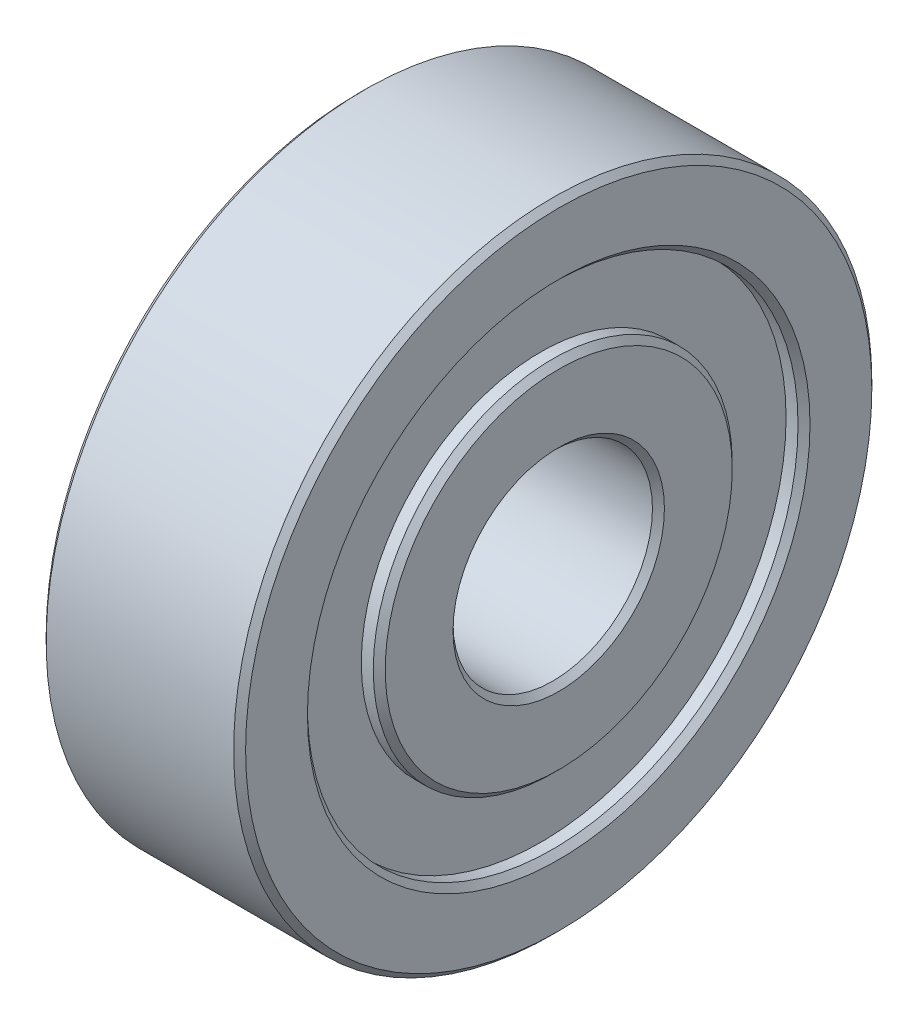
ISO-10303-21;
HEADER;
FILE_DESCRIPTION(('STEP AP214'),'2;1');
FILE_NAME('part.step','',(''),(''),'','','');
FILE_SCHEMA(('AUTOMOTIVE_DESIGN { 1 0 10303 214 1 1 1 1 }'));
ENDSEC;
DATA;
#1=APPLICATION_CONTEXT('core data for automotive mechanical design processes');
#2=APPLICATION_PROTOCOL_DEFINITION('international standard','automotive_design',2000,#1);
#3=PRODUCT_CONTEXT('',#1,'mechanical');
#4=PRODUCT('Part','Part','',(#3));
#5=PRODUCT_RELATED_PRODUCT_CATEGORY('part','',(#4));
#6=PRODUCT_DEFINITION_FORMATION('','',#4);
#7=PRODUCT_DEFINITION_CONTEXT('part definition',#1,'design');
#8=PRODUCT_DEFINITION('design','',#6,#7);
#9=PRODUCT_DEFINITION_SHAPE('','',#8);
#10=(LENGTH_UNIT() NAMED_UNIT(*) SI_UNIT(.MILLI.,.METRE.));
#11=(NAMED_UNIT(*) PLANE_ANGLE_UNIT() SI_UNIT($,.RADIAN.));
#12=(NAMED_UNIT(*) SI_UNIT($,.STERADIAN.) SOLID_ANGLE_UNIT());
#13=UNCERTAINTY_MEASURE_WITH_UNIT(LENGTH_MEASURE(1.E-05),#10,'distance_accuracy_value','');
#14=(GEOMETRIC_REPRESENTATION_CONTEXT(3) GLOBAL_UNCERTAINTY_ASSIGNED_CONTEXT((#13)) GLOBAL_UNIT_ASSIGNED_CONTEXT((#10,
#11,#12)) REPRESENTATION_CONTEXT('',''));
#15=CARTESIAN_POINT('',(0.,0.,0.));
#16=DIRECTION('',(0.,0.,1.));
#17=DIRECTION('',(1.,0.,0.));
#18=AXIS2_PLACEMENT_3D('',#15,#16,#17);
#19=CARTESIAN_POINT('',(2.5,0.,0.));
#20=DIRECTION('',(-1.,0.,0.));
#21=DIRECTION('',(0.,0.,1.));
#22=AXIS2_PLACEMENT_3D('',#19,#20,#21);
#23=CONICAL_SURFACE('',#22,7.85,0.785398163397451);
#24=CARTESIAN_POINT('',(2.5,0.,0.));
#25=DIRECTION('',(1.,0.,0.));
#26=DIRECTION('',(0.,0.,-1.));
#27=AXIS2_PLACEMENT_3D('',#24,#25,#26);
#28=CIRCLE('',#27,7.85);
#29=CARTESIAN_POINT('',(2.5,0.,-7.85));
#30=VERTEX_POINT('',#29);
#31=EDGE_CURVE('E96',#30,#30,#28,.T.);
#32=ORIENTED_EDGE('',*,*,#31,.F.);
#33=EDGE_LOOP('',(#32));
#34=FACE_BOUND('',#33,.T.);
#35=CARTESIAN_POINT('',(2.35,0.,0.));
#36=DIRECTION('',(-1.,0.,0.));
#37=DIRECTION('',(0.,0.,-1.));
#38=AXIS2_PLACEMENT_3D('',#35,#36,#37);
#39=CIRCLE('',#38,8.);
#40=CARTESIAN_POINT('',(2.35,0.,-8.));
#41=VERTEX_POINT('',#40);
#42=EDGE_CURVE('E82',#41,#41,#39,.T.);
#43=ORIENTED_EDGE('',*,*,#42,.F.);
#44=EDGE_LOOP('',(#43));
#45=FACE_BOUND('',#44,.T.);
#46=ADVANCED_FACE('F15',(#34,#45),#23,.T.);
#47=CARTESIAN_POINT('',(2.5,0.,0.));
#48=DIRECTION('',(1.,0.,0.));
#49=DIRECTION('',(0.,0.,-1.));
#50=AXIS2_PLACEMENT_3D('',#47,#48,#49);
#51=CONICAL_SURFACE('',#50,6.3,0.785398163397448);
#52=CARTESIAN_POINT('',(2.5,0.,0.));
#53=DIRECTION('',(-1.,0.,0.));
#54=DIRECTION('',(0.,0.,-1.));
#55=AXIS2_PLACEMENT_3D('',#52,#53,#54);
#56=CIRCLE('',#55,6.3);
#57=CARTESIAN_POINT('',(2.5,0.,-6.3));
#58=VERTEX_POINT('',#57);
#59=EDGE_CURVE('E99',#58,#58,#56,.T.);
#60=ORIENTED_EDGE('',*,*,#59,.F.);
#61=EDGE_LOOP('',(#60));
#62=FACE_BOUND('',#61,.T.);
#63=CARTESIAN_POINT('',(2.35,0.,0.));
#64=DIRECTION('',(1.,0.,0.));
#65=DIRECTION('',(0.,0.,-1.));
#66=AXIS2_PLACEMENT_3D('',#63,#64,#65);
#67=CIRCLE('',#66,6.15);
#68=CARTESIAN_POINT('',(2.35,0.,-6.15));
#69=VERTEX_POINT('',#68);
#70=EDGE_CURVE('E81',#69,#69,#67,.T.);
#71=ORIENTED_EDGE('',*,*,#70,.F.);
#72=EDGE_LOOP('',(#71));
#73=FACE_BOUND('',#72,.T.);
#74=ADVANCED_FACE('F17',(#62,#73),#51,.F.);
#75=CARTESIAN_POINT('',(-2.5,0.,0.));
#76=DIRECTION('',(1.,0.,0.));
#77=DIRECTION('',(0.,0.,-1.));
#78=AXIS2_PLACEMENT_3D('',#75,#76,#77);
#79=CONICAL_SURFACE('',#78,7.85,0.785398163397451);
#80=CARTESIAN_POINT('',(-2.5,0.,0.));
#81=DIRECTION('',(-1.,0.,0.));
#82=DIRECTION('',(0.,0.,-1.));
#83=AXIS2_PLACEMENT_3D('',#80,#81,#82);
#84=CIRCLE('',#83,7.85);
#85=CARTESIAN_POINT('',(-2.5,0.,-7.85));
#86=VERTEX_POINT('',#85);
#87=EDGE_CURVE('E66',#86,#86,#84,.T.);
#88=ORIENTED_EDGE('',*,*,#87,.F.);
#89=EDGE_LOOP('',(#88));
#90=FACE_BOUND('',#89,.T.);
#91=CARTESIAN_POINT('',(-2.35,0.,0.));
#92=DIRECTION('',(1.,0.,0.));
#93=DIRECTION('',(0.,0.,-1.));
#94=AXIS2_PLACEMENT_3D('',#91,#92,#93);
#95=CIRCLE('',#94,8.);
#96=CARTESIAN_POINT('',(-2.35,0.,-8.));
#97=VERTEX_POINT('',#96);
#98=EDGE_CURVE('E89',#97,#97,#95,.T.);
#99=ORIENTED_EDGE('',*,*,#98,.F.);
#100=EDGE_LOOP('',(#99));
#101=FACE_BOUND('',#100,.T.);
#102=ADVANCED_FACE('F113',(#90,#101),#79,.T.);
#103=CARTESIAN_POINT('',(-2.5,0.,0.));
#104=DIRECTION('',(-1.,0.,0.));
#105=DIRECTION('',(0.,0.,1.));
#106=AXIS2_PLACEMENT_3D('',#103,#104,#105);
#107=CONICAL_SURFACE('',#106,6.3,0.785398163397448);
#108=CARTESIAN_POINT('',(-2.5,0.,0.));
#109=DIRECTION('',(1.,0.,0.));
#110=DIRECTION('',(0.,0.,-1.));
#111=AXIS2_PLACEMENT_3D('',#108,#109,#110);
#112=CIRCLE('',#111,6.3);
#113=CARTESIAN_POINT('',(-2.5,0.,-6.3));
#114=VERTEX_POINT('',#113);
#115=EDGE_CURVE('E73',#114,#114,#112,.T.);
#116=ORIENTED_EDGE('',*,*,#115,.F.);
#117=EDGE_LOOP('',(#116));
#118=FACE_BOUND('',#117,.T.);
#119=CARTESIAN_POINT('',(-2.35,0.,0.));
#120=DIRECTION('',(-1.,0.,0.));
#121=DIRECTION('',(0.,0.,-1.));
#122=AXIS2_PLACEMENT_3D('',#119,#120,#121);
#123=CIRCLE('',#122,6.15);
#124=CARTESIAN_POINT('',(-2.35,0.,-6.15));
#125=VERTEX_POINT('',#124);
#126=EDGE_CURVE('E61',#125,#125,#123,.T.);
#127=ORIENTED_EDGE('',*,*,#126,.F.);
#128=EDGE_LOOP('',(#127));
#129=FACE_BOUND('',#128,.T.);
#130=ADVANCED_FACE('F191',(#118,#129),#107,.F.);
#131=CARTESIAN_POINT('',(2.5,0.,0.));
#132=DIRECTION('',(1.,0.,0.));
#133=DIRECTION('',(0.,0.,-1.));
#134=AXIS2_PLACEMENT_3D('',#131,#132,#133);
#135=CONICAL_SURFACE('',#134,2.65,0.785398163397448);
#136=CARTESIAN_POINT('',(2.5,0.,0.));
#137=DIRECTION('',(-1.,0.,0.));
#138=DIRECTION('',(0.,0.,-1.));
#139=AXIS2_PLACEMENT_3D('',#136,#137,#138);
#140=CIRCLE('',#139,2.65);
#141=CARTESIAN_POINT('',(2.5,0.,-2.65));
#142=VERTEX_POINT('',#141);
#143=EDGE_CURVE('E48',#142,#142,#140,.T.);
#144=ORIENTED_EDGE('',*,*,#143,.F.);
#145=EDGE_LOOP('',(#144));
#146=FACE_BOUND('',#145,.T.);
#147=CARTESIAN_POINT('',(2.35,0.,0.));
#148=DIRECTION('',(1.,0.,0.));
#149=DIRECTION('',(0.,0.,-1.));
#150=AXIS2_PLACEMENT_3D('',#147,#148,#149);
#151=CIRCLE('',#150,2.5);
#152=CARTESIAN_POINT('',(2.35,0.,-2.5));
#153=VERTEX_POINT('',#152);
#154=EDGE_CURVE('E43',#153,#153,#151,.T.);
#155=ORIENTED_EDGE('',*,*,#154,.F.);
#156=EDGE_LOOP('',(#155));
#157=FACE_BOUND('',#156,.T.);
#158=ADVANCED_FACE('F173',(#146,#157),#135,.F.);
#159=CARTESIAN_POINT('',(2.5,0.,0.));
#160=DIRECTION('',(-1.,0.,0.));
#161=DIRECTION('',(0.,0.,1.));
#162=AXIS2_PLACEMENT_3D('',#159,#160,#161);
#163=CONICAL_SURFACE('',#162,4.35,0.785398163397448);
#164=CARTESIAN_POINT('',(2.5,0.,0.));
#165=DIRECTION('',(1.,0.,0.));
#166=DIRECTION('',(0.,0.,-1.));
#167=AXIS2_PLACEMENT_3D('',#164,#165,#166);
#168=CIRCLE('',#167,4.35);
#169=CARTESIAN_POINT('',(2.5,0.,-4.35));
#170=VERTEX_POINT('',#169);
#171=EDGE_CURVE('E52',#170,#170,#168,.T.);
#172=ORIENTED_EDGE('',*,*,#171,.F.);
#173=EDGE_LOOP('',(#172));
#174=FACE_BOUND('',#173,.T.);
#175=CARTESIAN_POINT('',(2.35,0.,0.));
#176=DIRECTION('',(-1.,0.,0.));
#177=DIRECTION('',(0.,0.,-1.));
#178=AXIS2_PLACEMENT_3D('',#175,#176,#177);
#179=CIRCLE('',#178,4.5);
#180=CARTESIAN_POINT('',(2.35,0.,-4.5));
#181=VERTEX_POINT('',#180);
#182=EDGE_CURVE('E23',#181,#181,#179,.T.);
#183=ORIENTED_EDGE('',*,*,#182,.F.);
#184=EDGE_LOOP('',(#183));
#185=FACE_BOUND('',#184,.T.);
#186=ADVANCED_FACE('F164',(#174,#185),#163,.T.);
#187=CARTESIAN_POINT('',(-2.5,0.,0.));
#188=DIRECTION('',(-1.,0.,0.));
#189=DIRECTION('',(0.,0.,1.));
#190=AXIS2_PLACEMENT_3D('',#187,#188,#189);
#191=CONICAL_SURFACE('',#190,2.65,0.785398163397448);
#192=CARTESIAN_POINT('',(-2.5,0.,0.));
#193=DIRECTION('',(1.,0.,0.));
#194=DIRECTION('',(0.,0.,-1.));
#195=AXIS2_PLACEMENT_3D('',#192,#193,#194);
#196=CIRCLE('',#195,2.65);
#197=CARTESIAN_POINT('',(-2.5,0.,-2.65));
#198=VERTEX_POINT('',#197);
#199=EDGE_CURVE('E31',#198,#198,#196,.T.);
#200=ORIENTED_EDGE('',*,*,#199,.F.);
#201=EDGE_LOOP('',(#200));
#202=FACE_BOUND('',#201,.T.);
#203=CARTESIAN_POINT('',(-2.35,0.,0.));
#204=DIRECTION('',(-1.,0.,0.));
#205=DIRECTION('',(0.,0.,-1.));
#206=AXIS2_PLACEMENT_3D('',#203,#204,#205);
#207=CIRCLE('',#206,2.5);
#208=CARTESIAN_POINT('',(-2.35,0.,-2.5));
#209=VERTEX_POINT('',#208);
#210=EDGE_CURVE('E47',#209,#209,#207,.T.);
#211=ORIENTED_EDGE('',*,*,#210,.F.);
#212=EDGE_LOOP('',(#211));
#213=FACE_BOUND('',#212,.T.);
#214=ADVANCED_FACE('F162',(#202,#213),#191,.F.);
#215=CARTESIAN_POINT('',(-2.5,0.,0.));
#216=DIRECTION('',(1.,0.,0.));
#217=DIRECTION('',(0.,0.,-1.));
#218=AXIS2_PLACEMENT_3D('',#215,#216,#217);
#219=CONICAL_SURFACE('',#218,4.35,0.785398163397448);
#220=CARTESIAN_POINT('',(-2.5,0.,0.));
#221=DIRECTION('',(-1.,0.,0.));
#222=DIRECTION('',(0.,0.,-1.));
#223=AXIS2_PLACEMENT_3D('',#220,#221,#222);
#224=CIRCLE('',#223,4.35);
#225=CARTESIAN_POINT('',(-2.5,0.,-4.35));
#226=VERTEX_POINT('',#225);
#227=EDGE_CURVE('E38',#226,#226,#224,.T.);
#228=ORIENTED_EDGE('',*,*,#227,.F.);
#229=EDGE_LOOP('',(#228));
#230=FACE_BOUND('',#229,.T.);
#231=CARTESIAN_POINT('',(-2.35,0.,0.));
#232=DIRECTION('',(1.,0.,0.));
#233=DIRECTION('',(0.,0.,-1.));
#234=AXIS2_PLACEMENT_3D('',#231,#232,#233);
#235=CIRCLE('',#234,4.5);
#236=CARTESIAN_POINT('',(-2.35,0.,-4.5));
#237=VERTEX_POINT('',#236);
#238=EDGE_CURVE('E10',#237,#237,#235,.T.);
#239=ORIENTED_EDGE('',*,*,#238,.F.);
#240=EDGE_LOOP('',(#239));
#241=FACE_BOUND('',#240,.T.);
#242=ADVANCED_FACE('F145',(#230,#241),#219,.T.);
#243=CARTESIAN_POINT('',(0.,0.,0.));
#244=DIRECTION('',(1.,0.,0.));
#245=DIRECTION('',(0.,0.,-1.));
#246=AXIS2_PLACEMENT_3D('',#243,#244,#245);
#247=CYLINDRICAL_SURFACE('',#246,4.5);
#248=CARTESIAN_POINT('',(-2.15,0.,0.));
#249=DIRECTION('',(-1.,0.,0.));
#250=DIRECTION('',(0.,0.,-1.));
#251=AXIS2_PLACEMENT_3D('',#248,#249,#250);
#252=CIRCLE('',#251,4.5);
#253=CARTESIAN_POINT('',(-2.15,0.,-4.5));
#254=VERTEX_POINT('',#253);
#255=EDGE_CURVE('E57',#254,#254,#252,.T.);
#256=ORIENTED_EDGE('',*,*,#255,.T.);
#257=EDGE_LOOP('',(#256));
#258=FACE_BOUND('',#257,.T.);
#259=ORIENTED_EDGE('',*,*,#238,.T.);
#260=EDGE_LOOP('',(#259));
#261=FACE_BOUND('',#260,.T.);
#262=ADVANCED_FACE('F135',(#258,#261),#247,.T.);
#263=CARTESIAN_POINT('',(0.,0.,0.));
#264=DIRECTION('',(1.,0.,0.));
#265=DIRECTION('',(0.,0.,-1.));
#266=AXIS2_PLACEMENT_3D('',#263,#264,#265);
#267=CYLINDRICAL_SURFACE('',#266,4.5);
#268=CARTESIAN_POINT('',(2.05,0.,0.));
#269=DIRECTION('',(-1.,0.,0.));
#270=DIRECTION('',(0.,0.,-1.));
#271=AXIS2_PLACEMENT_3D('',#268,#269,#270);
#272=CIRCLE('',#271,4.5);
#273=CARTESIAN_POINT('',(2.05,0.,-4.5));
#274=VERTEX_POINT('',#273);
#275=EDGE_CURVE('E56',#274,#274,#272,.T.);
#276=ORIENTED_EDGE('',*,*,#275,.F.);
#277=EDGE_LOOP('',(#276));
#278=FACE_BOUND('',#277,.T.);
#279=ORIENTED_EDGE('',*,*,#182,.T.);
#280=EDGE_LOOP('',(#279));
#281=FACE_BOUND('',#280,.T.);
#282=ADVANCED_FACE('F132',(#278,#281),#267,.T.);
#283=CARTESIAN_POINT('',(-2.5,0.,0.));
#284=DIRECTION('',(1.,0.,0.));
#285=DIRECTION('',(0.,1.,0.));
#286=AXIS2_PLACEMENT_3D('',#283,#284,#285);
#287=PLANE('',#286);
#288=ORIENTED_EDGE('',*,*,#199,.T.);
#289=EDGE_LOOP('',(#288));
#290=FACE_BOUND('',#289,.T.);
#291=ORIENTED_EDGE('',*,*,#227,.T.);
#292=EDGE_LOOP('',(#291));
#293=FACE_BOUND('',#292,.T.);
#294=ADVANCED_FACE('F134',(#290,#293),#287,.F.);
#295=CARTESIAN_POINT('',(0.,0.,0.));
#296=DIRECTION('',(1.,0.,0.));
#297=DIRECTION('',(0.,0.,-1.));
#298=AXIS2_PLACEMENT_3D('',#295,#296,#297);
#299=CYLINDRICAL_SURFACE('',#298,2.5);
#300=ORIENTED_EDGE('',*,*,#154,.T.);
#301=EDGE_LOOP('',(#300));
#302=FACE_BOUND('',#301,.T.);
#303=ORIENTED_EDGE('',*,*,#210,.T.);
#304=EDGE_LOOP('',(#303));
#305=FACE_BOUND('',#304,.T.);
#306=ADVANCED_FACE('F142',(#302,#305),#299,.F.);
#307=CARTESIAN_POINT('',(2.5,0.,0.));
#308=DIRECTION('',(1.,0.,0.));
#309=DIRECTION('',(0.,1.,0.));
#310=AXIS2_PLACEMENT_3D('',#307,#308,#309);
#311=PLANE('',#310);
#312=ORIENTED_EDGE('',*,*,#143,.T.);
#313=EDGE_LOOP('',(#312));
#314=FACE_BOUND('',#313,.T.);
#315=ORIENTED_EDGE('',*,*,#171,.T.);
#316=EDGE_LOOP('',(#315));
#317=FACE_BOUND('',#316,.T.);
#318=ADVANCED_FACE('F128',(#314,#317),#311,.T.);
#319=CARTESIAN_POINT('',(2.05,0.,0.));
#320=DIRECTION('',(1.,0.,0.));
#321=DIRECTION('',(0.,1.,0.));
#322=AXIS2_PLACEMENT_3D('',#319,#320,#321);
#323=PLANE('',#322);
#324=CARTESIAN_POINT('',(2.05,0.,0.));
#325=DIRECTION('',(-1.,0.,0.));
#326=DIRECTION('',(0.,0.,-1.));
#327=AXIS2_PLACEMENT_3D('',#324,#325,#326);
#328=CIRCLE('',#327,6.15);
#329=CARTESIAN_POINT('',(2.05,0.,-6.15));
#330=VERTEX_POINT('',#329);
#331=EDGE_CURVE('E77',#330,#330,#328,.T.);
#332=ORIENTED_EDGE('',*,*,#331,.F.);
#333=EDGE_LOOP('',(#332));
#334=FACE_BOUND('',#333,.T.);
#335=ORIENTED_EDGE('',*,*,#275,.T.);
#336=EDGE_LOOP('',(#335));
#337=FACE_BOUND('',#336,.T.);
#338=ADVANCED_FACE('F124',(#334,#337),#323,.T.);
#339=CARTESIAN_POINT('',(-2.15,0.,0.));
#340=DIRECTION('',(1.,0.,0.));
#341=DIRECTION('',(0.,1.,0.));
#342=AXIS2_PLACEMENT_3D('',#339,#340,#341);
#343=PLANE('',#342);
#344=CARTESIAN_POINT('',(-2.15,0.,0.));
#345=DIRECTION('',(1.,0.,0.));
#346=DIRECTION('',(0.,0.,-1.));
#347=AXIS2_PLACEMENT_3D('',#344,#345,#346);
#348=CIRCLE('',#347,6.15);
#349=CARTESIAN_POINT('',(-2.15,0.,-6.15));
#350=VERTEX_POINT('',#349);
#351=EDGE_CURVE('E62',#350,#350,#348,.T.);
#352=ORIENTED_EDGE('',*,*,#351,.F.);
#353=EDGE_LOOP('',(#352));
#354=FACE_BOUND('',#353,.T.);
#355=ORIENTED_EDGE('',*,*,#255,.F.);
#356=EDGE_LOOP('',(#355));
#357=FACE_BOUND('',#356,.T.);
#358=ADVANCED_FACE('F127',(#354,#357),#343,.F.);
#359=CARTESIAN_POINT('',(0.,0.,0.));
#360=DIRECTION('',(1.,0.,0.));
#361=DIRECTION('',(0.,0.,-1.));
#362=AXIS2_PLACEMENT_3D('',#359,#360,#361);
#363=CYLINDRICAL_SURFACE('',#362,6.15);
#364=ORIENTED_EDGE('',*,*,#126,.T.);
#365=EDGE_LOOP('',(#364));
#366=FACE_BOUND('',#365,.T.);
#367=ORIENTED_EDGE('',*,*,#351,.T.);
#368=EDGE_LOOP('',(#367));
#369=FACE_BOUND('',#368,.T.);
#370=ADVANCED_FACE('F159',(#366,#369),#363,.F.);
#371=CARTESIAN_POINT('',(-2.5,0.,0.));
#372=DIRECTION('',(1.,0.,0.));
#373=DIRECTION('',(0.,1.,0.));
#374=AXIS2_PLACEMENT_3D('',#371,#372,#373);
#375=PLANE('',#374);
#376=ORIENTED_EDGE('',*,*,#87,.T.);
#377=EDGE_LOOP('',(#376));
#378=FACE_BOUND('',#377,.T.);
#379=ORIENTED_EDGE('',*,*,#115,.T.);
#380=EDGE_LOOP('',(#379));
#381=FACE_BOUND('',#380,.T.);
#382=ADVANCED_FACE('F120',(#378,#381),#375,.F.);
#383=CARTESIAN_POINT('',(0.,0.,0.));
#384=DIRECTION('',(1.,0.,0.));
#385=DIRECTION('',(0.,0.,-1.));
#386=AXIS2_PLACEMENT_3D('',#383,#384,#385);
#387=CYLINDRICAL_SURFACE('',#386,6.15);
#388=ORIENTED_EDGE('',*,*,#70,.T.);
#389=EDGE_LOOP('',(#388));
#390=FACE_BOUND('',#389,.T.);
#391=ORIENTED_EDGE('',*,*,#331,.T.);
#392=EDGE_LOOP('',(#391));
#393=FACE_BOUND('',#392,.T.);
#394=ADVANCED_FACE('F116',(#390,#393),#387,.F.);
#395=CARTESIAN_POINT('',(0.,0.,0.));
#396=DIRECTION('',(1.,0.,0.));
#397=DIRECTION('',(0.,0.,-1.));
#398=AXIS2_PLACEMENT_3D('',#395,#396,#397);
#399=CYLINDRICAL_SURFACE('',#398,8.);
#400=ORIENTED_EDGE('',*,*,#42,.T.);
#401=EDGE_LOOP('',(#400));
#402=FACE_BOUND('',#401,.T.);
#403=ORIENTED_EDGE('',*,*,#98,.T.);
#404=EDGE_LOOP('',(#403));
#405=FACE_BOUND('',#404,.T.);
#406=ADVANCED_FACE('F119',(#402,#405),#399,.T.);
#407=CARTESIAN_POINT('',(2.5,0.,0.));
#408=DIRECTION('',(1.,0.,0.));
#409=DIRECTION('',(0.,1.,0.));
#410=AXIS2_PLACEMENT_3D('',#407,#408,#409);
#411=PLANE('',#410);
#412=ORIENTED_EDGE('',*,*,#31,.T.);
#413=EDGE_LOOP('',(#412));
#414=FACE_BOUND('',#413,.T.);
#415=ORIENTED_EDGE('',*,*,#59,.T.);
#416=EDGE_LOOP('',(#415));
#417=FACE_BOUND('',#416,.T.);
#418=ADVANCED_FACE('F109',(#414,#417),#411,.T.);
#419=CLOSED_SHELL('',(#46,#74,#102,#130,#158,#186,#214,#242,#262,#282,#294,#306,#318,#338,#358,
#370,#382,#394,#406,#418));
#420=MANIFOLD_SOLID_BREP('B1',#419);
#421=ADVANCED_BREP_SHAPE_REPRESENTATION('',(#18,#420),#14);
#422=SHAPE_DEFINITION_REPRESENTATION(#9,#421);
ENDSEC;
END-ISO-10303-21;
